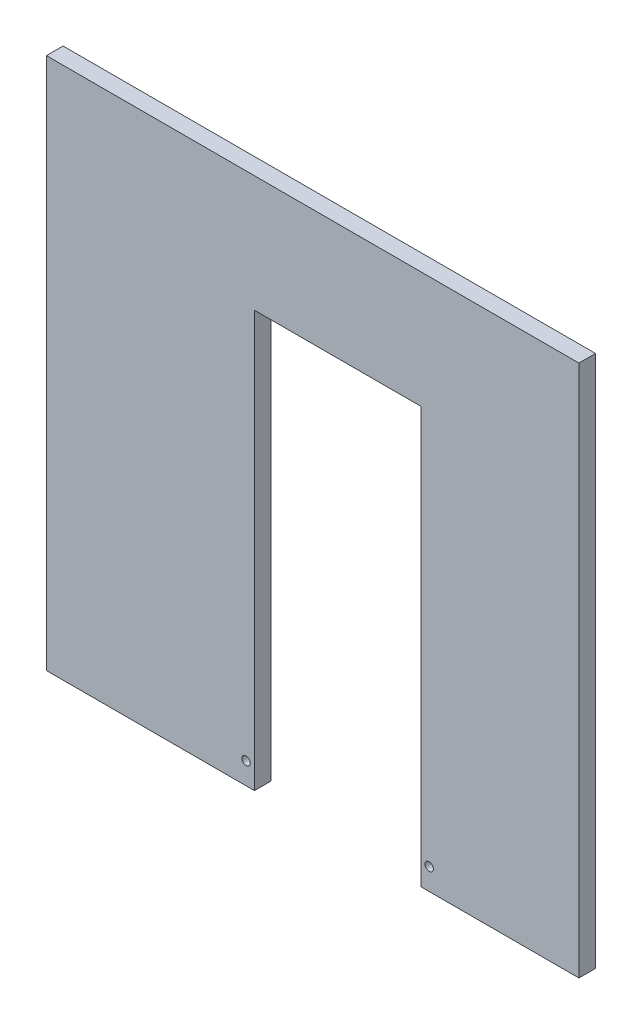
ISO-10303-21;
HEADER;
FILE_DESCRIPTION(('STEP AP214'),'2;1');
FILE_NAME('part.step','',(''),(''),'','','');
FILE_SCHEMA(('AUTOMOTIVE_DESIGN { 1 0 10303 214 1 1 1 1 }'));
ENDSEC;
DATA;
#1=APPLICATION_CONTEXT('core data for automotive mechanical design processes');
#2=APPLICATION_PROTOCOL_DEFINITION('international standard','automotive_design',2000,#1);
#3=PRODUCT_CONTEXT('',#1,'mechanical');
#4=PRODUCT('Part','Part','',(#3));
#5=PRODUCT_RELATED_PRODUCT_CATEGORY('part','',(#4));
#6=PRODUCT_DEFINITION_FORMATION('','',#4);
#7=PRODUCT_DEFINITION_CONTEXT('part definition',#1,'design');
#8=PRODUCT_DEFINITION('design','',#6,#7);
#9=PRODUCT_DEFINITION_SHAPE('','',#8);
#10=(LENGTH_UNIT() NAMED_UNIT(*) SI_UNIT(.MILLI.,.METRE.));
#11=(NAMED_UNIT(*) PLANE_ANGLE_UNIT() SI_UNIT($,.RADIAN.));
#12=(NAMED_UNIT(*) SI_UNIT($,.STERADIAN.) SOLID_ANGLE_UNIT());
#13=UNCERTAINTY_MEASURE_WITH_UNIT(LENGTH_MEASURE(1.E-05),#10,'distance_accuracy_value','');
#14=(GEOMETRIC_REPRESENTATION_CONTEXT(3) GLOBAL_UNCERTAINTY_ASSIGNED_CONTEXT((#13)) GLOBAL_UNIT_ASSIGNED_CONTEXT((#10,
#11,#12)) REPRESENTATION_CONTEXT('',''));
#15=CARTESIAN_POINT('',(0.,0.,0.));
#16=DIRECTION('',(0.,0.,1.));
#17=DIRECTION('',(1.,0.,0.));
#18=AXIS2_PLACEMENT_3D('',#15,#16,#17);
#19=CARTESIAN_POINT('',(0.,0.,-12.7));
#20=DIRECTION('',(0.,1.,0.));
#21=DIRECTION('',(0.,0.,-1.));
#22=AXIS2_PLACEMENT_3D('',#19,#20,#21);
#23=PLANE('',#22);
#24=DIRECTION('',(1.,0.,0.));
#25=VECTOR('',#24,1.);
#26=CARTESIAN_POINT('',(0.,0.,0.));
#27=LINE('',#26,#25);
#28=CARTESIAN_POINT('',(0.,0.,0.));
#29=VERTEX_POINT('',#28);
#30=CARTESIAN_POINT('',(158.75,0.,0.));
#31=VERTEX_POINT('',#30);
#32=EDGE_CURVE('E166',#29,#31,#27,.T.);
#33=ORIENTED_EDGE('',*,*,#32,.F.);
#34=DIRECTION('',(0.,0.,1.));
#35=VECTOR('',#34,1.);
#36=CARTESIAN_POINT('',(0.,0.,-12.7));
#37=LINE('',#36,#35);
#38=CARTESIAN_POINT('',(0.,0.,-12.7));
#39=VERTEX_POINT('',#38);
#40=EDGE_CURVE('E11',#39,#29,#37,.T.);
#41=ORIENTED_EDGE('',*,*,#40,.F.);
#42=DIRECTION('',(1.,0.,0.));
#43=VECTOR('',#42,1.);
#44=CARTESIAN_POINT('',(0.,0.,-12.7));
#45=LINE('',#44,#43);
#46=CARTESIAN_POINT('',(158.75,0.,-12.7));
#47=VERTEX_POINT('',#46);
#48=EDGE_CURVE('E156',#39,#47,#45,.T.);
#49=ORIENTED_EDGE('',*,*,#48,.T.);
#50=DIRECTION('',(0.,0.,1.));
#51=VECTOR('',#50,1.);
#52=CARTESIAN_POINT('',(158.75,0.,-44.45));
#53=LINE('',#52,#51);
#54=EDGE_CURVE('E135',#47,#31,#53,.T.);
#55=ORIENTED_EDGE('',*,*,#54,.T.);
#56=EDGE_LOOP('',(#33,#41,#49,#55));
#57=FACE_BOUND('',#56,.T.);
#58=ADVANCED_FACE('F37',(#57),#23,.F.);
#59=CARTESIAN_POINT('',(0.,0.,-12.7));
#60=DIRECTION('',(1.,0.,0.));
#61=DIRECTION('',(0.,0.,1.));
#62=AXIS2_PLACEMENT_3D('',#59,#60,#61);
#63=PLANE('',#62);
#64=DIRECTION('',(0.,-1.,0.));
#65=VECTOR('',#64,1.);
#66=CARTESIAN_POINT('',(0.,0.,0.));
#67=LINE('',#66,#65);
#68=CARTESIAN_POINT('',(0.,406.4,0.));
#69=VERTEX_POINT('',#68);
#70=EDGE_CURVE('E153',#69,#29,#67,.T.);
#71=ORIENTED_EDGE('',*,*,#70,.F.);
#72=DIRECTION('',(0.,0.,1.));
#73=VECTOR('',#72,1.);
#74=CARTESIAN_POINT('',(0.,406.4,-12.7));
#75=LINE('',#74,#73);
#76=CARTESIAN_POINT('',(0.,406.4,-12.7));
#77=VERTEX_POINT('',#76);
#78=EDGE_CURVE('E163',#77,#69,#75,.T.);
#79=ORIENTED_EDGE('',*,*,#78,.F.);
#80=DIRECTION('',(0.,-1.,0.));
#81=VECTOR('',#80,1.);
#82=CARTESIAN_POINT('',(0.,0.,-12.7));
#83=LINE('',#82,#81);
#84=EDGE_CURVE('E86',#77,#39,#83,.T.);
#85=ORIENTED_EDGE('',*,*,#84,.T.);
#86=ORIENTED_EDGE('',*,*,#40,.T.);
#87=EDGE_LOOP('',(#71,#79,#85,#86));
#88=FACE_BOUND('',#87,.T.);
#89=ADVANCED_FACE('F39',(#88),#63,.F.);
#90=CARTESIAN_POINT('',(285.75,0.,-12.7));
#91=VERTEX_POINT('',#90);
#92=CARTESIAN_POINT('',(406.4,0.,-12.7));
#93=VERTEX_POINT('',#92);
#94=EDGE_CURVE('E155',#91,#93,#45,.T.);
#95=ORIENTED_EDGE('',*,*,#94,.T.);
#96=DIRECTION('',(0.,0.,1.));
#97=VECTOR('',#96,1.);
#98=CARTESIAN_POINT('',(406.4,0.,-12.7));
#99=LINE('',#98,#97);
#100=CARTESIAN_POINT('',(406.4,0.,0.));
#101=VERTEX_POINT('',#100);
#102=EDGE_CURVE('E45',#93,#101,#99,.T.);
#103=ORIENTED_EDGE('',*,*,#102,.T.);
#104=CARTESIAN_POINT('',(285.75,0.,0.));
#105=VERTEX_POINT('',#104);
#106=EDGE_CURVE('E165',#105,#101,#27,.T.);
#107=ORIENTED_EDGE('',*,*,#106,.F.);
#108=DIRECTION('',(0.,0.,1.));
#109=VECTOR('',#108,1.);
#110=CARTESIAN_POINT('',(285.75,0.,-44.45));
#111=LINE('',#110,#109);
#112=EDGE_CURVE('E119',#91,#105,#111,.T.);
#113=ORIENTED_EDGE('',*,*,#112,.F.);
#114=EDGE_LOOP('',(#95,#103,#107,#113));
#115=FACE_BOUND('',#114,.T.);
#116=ADVANCED_FACE('F178',(#115),#23,.F.);
#117=CARTESIAN_POINT('',(406.4,0.,-12.7));
#118=DIRECTION('',(-1.,0.,0.));
#119=DIRECTION('',(0.,0.,-1.));
#120=AXIS2_PLACEMENT_3D('',#117,#118,#119);
#121=PLANE('',#120);
#122=DIRECTION('',(0.,1.,0.));
#123=VECTOR('',#122,1.);
#124=CARTESIAN_POINT('',(406.4,0.,0.));
#125=LINE('',#124,#123);
#126=CARTESIAN_POINT('',(406.4,406.4,0.));
#127=VERTEX_POINT('',#126);
#128=EDGE_CURVE('E168',#101,#127,#125,.T.);
#129=ORIENTED_EDGE('',*,*,#128,.F.);
#130=ORIENTED_EDGE('',*,*,#102,.F.);
#131=DIRECTION('',(0.,1.,0.));
#132=VECTOR('',#131,1.);
#133=CARTESIAN_POINT('',(406.4,0.,-12.7));
#134=LINE('',#133,#132);
#135=CARTESIAN_POINT('',(406.4,406.4,-12.7));
#136=VERTEX_POINT('',#135);
#137=EDGE_CURVE('E159',#93,#136,#134,.T.);
#138=ORIENTED_EDGE('',*,*,#137,.T.);
#139=DIRECTION('',(0.,0.,1.));
#140=VECTOR('',#139,1.);
#141=CARTESIAN_POINT('',(406.4,406.4,-12.7));
#142=LINE('',#141,#140);
#143=EDGE_CURVE('E172',#136,#127,#142,.T.);
#144=ORIENTED_EDGE('',*,*,#143,.T.);
#145=EDGE_LOOP('',(#129,#130,#138,#144));
#146=FACE_BOUND('',#145,.T.);
#147=ADVANCED_FACE('F181',(#146),#121,.F.);
#148=CARTESIAN_POINT('',(0.,406.4,-12.7));
#149=DIRECTION('',(0.,-1.,0.));
#150=DIRECTION('',(0.,0.,1.));
#151=AXIS2_PLACEMENT_3D('',#148,#149,#150);
#152=PLANE('',#151);
#153=DIRECTION('',(-1.,0.,0.));
#154=VECTOR('',#153,1.);
#155=CARTESIAN_POINT('',(0.,406.4,0.));
#156=LINE('',#155,#154);
#157=EDGE_CURVE('E81',#127,#69,#156,.T.);
#158=ORIENTED_EDGE('',*,*,#157,.F.);
#159=ORIENTED_EDGE('',*,*,#143,.F.);
#160=DIRECTION('',(-1.,0.,0.));
#161=VECTOR('',#160,1.);
#162=CARTESIAN_POINT('',(0.,406.4,-12.7));
#163=LINE('',#162,#161);
#164=EDGE_CURVE('E61',#136,#77,#163,.T.);
#165=ORIENTED_EDGE('',*,*,#164,.T.);
#166=ORIENTED_EDGE('',*,*,#78,.T.);
#167=EDGE_LOOP('',(#158,#159,#165,#166));
#168=FACE_BOUND('',#167,.T.);
#169=ADVANCED_FACE('F182',(#168),#152,.F.);
#170=CARTESIAN_POINT('',(0.,0.,-12.7));
#171=DIRECTION('',(0.,0.,1.));
#172=DIRECTION('',(-1.,0.,0.));
#173=AXIS2_PLACEMENT_3D('',#170,#171,#172);
#174=PLANE('',#173);
#175=CARTESIAN_POINT('',(292.1,16.51,-12.7));
#176=DIRECTION('',(0.,0.,-1.));
#177=DIRECTION('',(-1.,0.,0.));
#178=AXIS2_PLACEMENT_3D('',#175,#176,#177);
#179=CIRCLE('',#178,3.17499999999997);
#180=CARTESIAN_POINT('',(288.925,16.51,-12.7));
#181=VERTEX_POINT('',#180);
#182=EDGE_CURVE('E150',#181,#181,#179,.T.);
#183=ORIENTED_EDGE('',*,*,#182,.F.);
#184=EDGE_LOOP('',(#183));
#185=FACE_BOUND('',#184,.T.);
#186=CARTESIAN_POINT('',(152.4,16.51,-12.7));
#187=DIRECTION('',(0.,0.,-1.));
#188=DIRECTION('',(-1.,0.,0.));
#189=AXIS2_PLACEMENT_3D('',#186,#187,#188);
#190=CIRCLE('',#189,3.175);
#191=CARTESIAN_POINT('',(149.225,16.51,-12.7));
#192=VERTEX_POINT('',#191);
#193=EDGE_CURVE('E147',#192,#192,#190,.T.);
#194=ORIENTED_EDGE('',*,*,#193,.F.);
#195=EDGE_LOOP('',(#194));
#196=FACE_BOUND('',#195,.T.);
#197=ORIENTED_EDGE('',*,*,#48,.F.);
#198=ORIENTED_EDGE('',*,*,#84,.F.);
#199=ORIENTED_EDGE('',*,*,#164,.F.);
#200=ORIENTED_EDGE('',*,*,#137,.F.);
#201=ORIENTED_EDGE('',*,*,#94,.F.);
#202=DIRECTION('',(0.,-1.,0.));
#203=VECTOR('',#202,1.);
#204=CARTESIAN_POINT('',(285.75,0.,-12.7));
#205=LINE('',#204,#203);
#206=CARTESIAN_POINT('',(285.75,317.5,-12.7));
#207=VERTEX_POINT('',#206);
#208=EDGE_CURVE('E142',#207,#91,#205,.T.);
#209=ORIENTED_EDGE('',*,*,#208,.F.);
#210=DIRECTION('',(1.,0.,0.));
#211=VECTOR('',#210,1.);
#212=CARTESIAN_POINT('',(0.,317.5,-12.7));
#213=LINE('',#212,#211);
#214=CARTESIAN_POINT('',(158.75,317.5,-12.7));
#215=VERTEX_POINT('',#214);
#216=EDGE_CURVE('E116',#215,#207,#213,.T.);
#217=ORIENTED_EDGE('',*,*,#216,.F.);
#218=DIRECTION('',(0.,1.,0.));
#219=VECTOR('',#218,1.);
#220=CARTESIAN_POINT('',(158.75,0.,-12.7));
#221=LINE('',#220,#219);
#222=EDGE_CURVE('E145',#47,#215,#221,.T.);
#223=ORIENTED_EDGE('',*,*,#222,.F.);
#224=EDGE_LOOP('',(#197,#198,#199,#200,#201,#209,#217,#223));
#225=FACE_BOUND('',#224,.T.);
#226=ADVANCED_FACE('F190',(#185,#196,#225),#174,.F.);
#227=CARTESIAN_POINT('',(0.,0.,0.));
#228=DIRECTION('',(0.,0.,1.));
#229=DIRECTION('',(-1.,0.,0.));
#230=AXIS2_PLACEMENT_3D('',#227,#228,#229);
#231=PLANE('',#230);
#232=CARTESIAN_POINT('',(292.1,16.51,0.));
#233=DIRECTION('',(0.,0.,-1.));
#234=DIRECTION('',(-1.,0.,0.));
#235=AXIS2_PLACEMENT_3D('',#232,#233,#234);
#236=CIRCLE('',#235,3.17499999999997);
#237=CARTESIAN_POINT('',(288.925,16.51,0.));
#238=VERTEX_POINT('',#237);
#239=EDGE_CURVE('E143',#238,#238,#236,.T.);
#240=ORIENTED_EDGE('',*,*,#239,.T.);
#241=EDGE_LOOP('',(#240));
#242=FACE_BOUND('',#241,.T.);
#243=CARTESIAN_POINT('',(152.4,16.51,0.));
#244=DIRECTION('',(0.,0.,-1.));
#245=DIRECTION('',(-1.,0.,0.));
#246=AXIS2_PLACEMENT_3D('',#243,#244,#245);
#247=CIRCLE('',#246,3.175);
#248=CARTESIAN_POINT('',(149.225,16.51,0.));
#249=VERTEX_POINT('',#248);
#250=EDGE_CURVE('E138',#249,#249,#247,.T.);
#251=ORIENTED_EDGE('',*,*,#250,.T.);
#252=EDGE_LOOP('',(#251));
#253=FACE_BOUND('',#252,.T.);
#254=DIRECTION('',(0.,1.,0.));
#255=VECTOR('',#254,1.);
#256=CARTESIAN_POINT('',(158.75,0.,0.));
#257=LINE('',#256,#255);
#258=CARTESIAN_POINT('',(158.75,317.5,0.));
#259=VERTEX_POINT('',#258);
#260=EDGE_CURVE('E130',#31,#259,#257,.T.);
#261=ORIENTED_EDGE('',*,*,#260,.T.);
#262=DIRECTION('',(1.,0.,0.));
#263=VECTOR('',#262,1.);
#264=CARTESIAN_POINT('',(158.75,317.5,0.));
#265=LINE('',#264,#263);
#266=CARTESIAN_POINT('',(285.75,317.5,0.));
#267=VERTEX_POINT('',#266);
#268=EDGE_CURVE('E113',#259,#267,#265,.T.);
#269=ORIENTED_EDGE('',*,*,#268,.T.);
#270=DIRECTION('',(0.,-1.,0.));
#271=VECTOR('',#270,1.);
#272=CARTESIAN_POINT('',(285.75,0.,0.));
#273=LINE('',#272,#271);
#274=EDGE_CURVE('E122',#267,#105,#273,.T.);
#275=ORIENTED_EDGE('',*,*,#274,.T.);
#276=ORIENTED_EDGE('',*,*,#106,.T.);
#277=ORIENTED_EDGE('',*,*,#128,.T.);
#278=ORIENTED_EDGE('',*,*,#157,.T.);
#279=ORIENTED_EDGE('',*,*,#70,.T.);
#280=ORIENTED_EDGE('',*,*,#32,.T.);
#281=EDGE_LOOP('',(#261,#269,#275,#276,#277,#278,#279,#280));
#282=FACE_BOUND('',#281,.T.);
#283=ADVANCED_FACE('F128',(#242,#253,#282),#231,.T.);
#284=CARTESIAN_POINT('',(158.75,0.,-44.45));
#285=DIRECTION('',(-1.,0.,0.));
#286=DIRECTION('',(0.,0.,-1.));
#287=AXIS2_PLACEMENT_3D('',#284,#285,#286);
#288=PLANE('',#287);
#289=ORIENTED_EDGE('',*,*,#54,.F.);
#290=ORIENTED_EDGE('',*,*,#222,.T.);
#291=DIRECTION('',(0.,0.,1.));
#292=VECTOR('',#291,1.);
#293=CARTESIAN_POINT('',(158.75,317.5,-44.45));
#294=LINE('',#293,#292);
#295=EDGE_CURVE('E52',#215,#259,#294,.T.);
#296=ORIENTED_EDGE('',*,*,#295,.T.);
#297=ORIENTED_EDGE('',*,*,#260,.F.);
#298=EDGE_LOOP('',(#289,#290,#296,#297));
#299=FACE_BOUND('',#298,.T.);
#300=ADVANCED_FACE('F188',(#299),#288,.F.);
#301=CARTESIAN_POINT('',(285.75,0.,-44.45));
#302=DIRECTION('',(1.,0.,0.));
#303=DIRECTION('',(0.,0.,1.));
#304=AXIS2_PLACEMENT_3D('',#301,#302,#303);
#305=PLANE('',#304);
#306=DIRECTION('',(0.,0.,1.));
#307=VECTOR('',#306,1.);
#308=CARTESIAN_POINT('',(285.75,317.5,-44.45));
#309=LINE('',#308,#307);
#310=EDGE_CURVE('E109',#207,#267,#309,.T.);
#311=ORIENTED_EDGE('',*,*,#310,.F.);
#312=ORIENTED_EDGE('',*,*,#208,.T.);
#313=ORIENTED_EDGE('',*,*,#112,.T.);
#314=ORIENTED_EDGE('',*,*,#274,.F.);
#315=EDGE_LOOP('',(#311,#312,#313,#314));
#316=FACE_BOUND('',#315,.T.);
#317=ADVANCED_FACE('F123',(#316),#305,.F.);
#318=CARTESIAN_POINT('',(158.75,317.5,-44.45));
#319=DIRECTION('',(0.,1.,0.));
#320=DIRECTION('',(0.,0.,-1.));
#321=AXIS2_PLACEMENT_3D('',#318,#319,#320);
#322=PLANE('',#321);
#323=ORIENTED_EDGE('',*,*,#295,.F.);
#324=ORIENTED_EDGE('',*,*,#216,.T.);
#325=ORIENTED_EDGE('',*,*,#310,.T.);
#326=ORIENTED_EDGE('',*,*,#268,.F.);
#327=EDGE_LOOP('',(#323,#324,#325,#326));
#328=FACE_BOUND('',#327,.T.);
#329=ADVANCED_FACE('F111',(#328),#322,.F.);
#330=CARTESIAN_POINT('',(152.4,16.51,-44.45));
#331=DIRECTION('',(0.,0.,1.));
#332=DIRECTION('',(-1.,0.,0.));
#333=AXIS2_PLACEMENT_3D('',#330,#331,#332);
#334=CYLINDRICAL_SURFACE('',#333,3.175);
#335=ORIENTED_EDGE('',*,*,#250,.F.);
#336=EDGE_LOOP('',(#335));
#337=FACE_BOUND('',#336,.T.);
#338=ORIENTED_EDGE('',*,*,#193,.T.);
#339=EDGE_LOOP('',(#338));
#340=FACE_BOUND('',#339,.T.);
#341=ADVANCED_FACE('F253',(#337,#340),#334,.F.);
#342=CARTESIAN_POINT('',(292.1,16.51,-44.45));
#343=DIRECTION('',(0.,0.,1.));
#344=DIRECTION('',(-1.,0.,0.));
#345=AXIS2_PLACEMENT_3D('',#342,#343,#344);
#346=CYLINDRICAL_SURFACE('',#345,3.17499999999997);
#347=ORIENTED_EDGE('',*,*,#239,.F.);
#348=EDGE_LOOP('',(#347));
#349=FACE_BOUND('',#348,.T.);
#350=ORIENTED_EDGE('',*,*,#182,.T.);
#351=EDGE_LOOP('',(#350));
#352=FACE_BOUND('',#351,.T.);
#353=ADVANCED_FACE('F262',(#349,#352),#346,.F.);
#354=CLOSED_SHELL('',(#58,#89,#116,#147,#169,#226,#283,#300,#317,#329,#341,#353));
#355=MANIFOLD_SOLID_BREP('B2',#354);
#356=ADVANCED_BREP_SHAPE_REPRESENTATION('',(#18,#355),#14);
#357=SHAPE_DEFINITION_REPRESENTATION(#9,#356);
ENDSEC;
END-ISO-10303-21;
